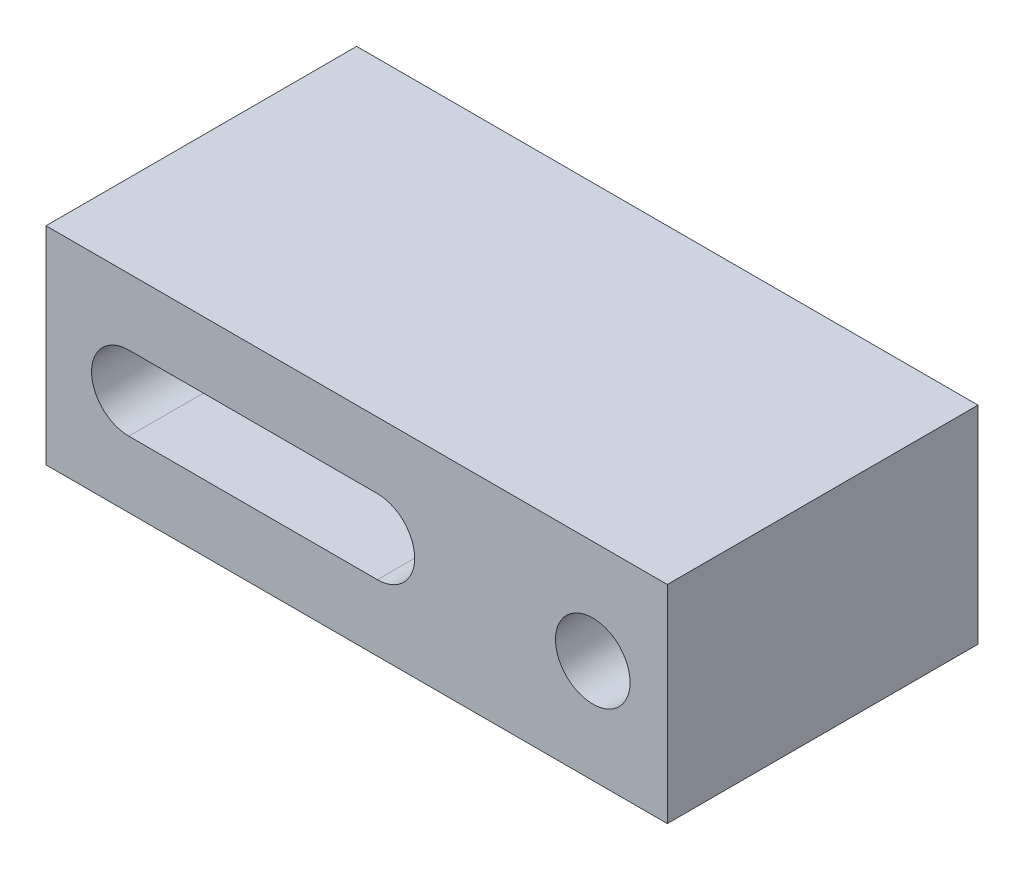
ISO-10303-21;
HEADER;
FILE_DESCRIPTION(('STEP AP214'),'2;1');
FILE_NAME('part.step','',(''),(''),'','','');
FILE_SCHEMA(('AUTOMOTIVE_DESIGN { 1 0 10303 214 1 1 1 1 }'));
ENDSEC;
DATA;
#1=APPLICATION_CONTEXT('core data for automotive mechanical design processes');
#2=APPLICATION_PROTOCOL_DEFINITION('international standard','automotive_design',2000,#1);
#3=PRODUCT_CONTEXT('',#1,'mechanical');
#4=PRODUCT('Part','Part','',(#3));
#5=PRODUCT_RELATED_PRODUCT_CATEGORY('part','',(#4));
#6=PRODUCT_DEFINITION_FORMATION('','',#4);
#7=PRODUCT_DEFINITION_CONTEXT('part definition',#1,'design');
#8=PRODUCT_DEFINITION('design','',#6,#7);
#9=PRODUCT_DEFINITION_SHAPE('','',#8);
#10=(LENGTH_UNIT() NAMED_UNIT(*) SI_UNIT(.MILLI.,.METRE.));
#11=(NAMED_UNIT(*) PLANE_ANGLE_UNIT() SI_UNIT($,.RADIAN.));
#12=(NAMED_UNIT(*) SI_UNIT($,.STERADIAN.) SOLID_ANGLE_UNIT());
#13=UNCERTAINTY_MEASURE_WITH_UNIT(LENGTH_MEASURE(1.E-05),#10,'distance_accuracy_value','');
#14=(GEOMETRIC_REPRESENTATION_CONTEXT(3) GLOBAL_UNCERTAINTY_ASSIGNED_CONTEXT((#13)) GLOBAL_UNIT_ASSIGNED_CONTEXT((#10,
#11,#12)) REPRESENTATION_CONTEXT('',''));
#15=CARTESIAN_POINT('',(0.,0.,0.));
#16=DIRECTION('',(0.,0.,1.));
#17=DIRECTION('',(1.,0.,0.));
#18=AXIS2_PLACEMENT_3D('',#15,#16,#17);
#19=CARTESIAN_POINT('',(750.,500.,-375.));
#20=DIRECTION('',(-1.,0.,0.));
#21=DIRECTION('',(0.,0.,1.));
#22=AXIS2_PLACEMENT_3D('',#19,#20,#21);
#23=PLANE('',#22);
#24=DIRECTION('',(0.,0.,-1.));
#25=VECTOR('',#24,1.);
#26=CARTESIAN_POINT('',(750.,0.,-375.));
#27=LINE('',#26,#25);
#28=CARTESIAN_POINT('',(750.,0.,375.));
#29=VERTEX_POINT('',#28);
#30=CARTESIAN_POINT('',(750.,0.,-375.));
#31=VERTEX_POINT('',#30);
#32=EDGE_CURVE('E135',#29,#31,#27,.T.);
#33=ORIENTED_EDGE('',*,*,#32,.T.);
#34=DIRECTION('',(0.,-1.,0.));
#35=VECTOR('',#34,1.);
#36=CARTESIAN_POINT('',(750.,500.,-375.));
#37=LINE('',#36,#35);
#38=CARTESIAN_POINT('',(750.,500.,-375.));
#39=VERTEX_POINT('',#38);
#40=EDGE_CURVE('E11',#39,#31,#37,.T.);
#41=ORIENTED_EDGE('',*,*,#40,.F.);
#42=DIRECTION('',(0.,0.,-1.));
#43=VECTOR('',#42,1.);
#44=CARTESIAN_POINT('',(750.,500.,-375.));
#45=LINE('',#44,#43);
#46=CARTESIAN_POINT('',(750.,500.,375.));
#47=VERTEX_POINT('',#46);
#48=EDGE_CURVE('E144',#47,#39,#45,.T.);
#49=ORIENTED_EDGE('',*,*,#48,.F.);
#50=DIRECTION('',(0.,-1.,0.));
#51=VECTOR('',#50,1.);
#52=CARTESIAN_POINT('',(750.,500.,375.));
#53=LINE('',#52,#51);
#54=EDGE_CURVE('E154',#47,#29,#53,.T.);
#55=ORIENTED_EDGE('',*,*,#54,.T.);
#56=EDGE_LOOP('',(#33,#41,#49,#55));
#57=FACE_BOUND('',#56,.T.);
#58=ADVANCED_FACE('F37',(#57),#23,.F.);
#59=CARTESIAN_POINT('',(-750.,500.,-375.));
#60=DIRECTION('',(0.,0.,1.));
#61=DIRECTION('',(1.,0.,0.));
#62=AXIS2_PLACEMENT_3D('',#59,#60,#61);
#63=PLANE('',#62);
#64=DIRECTION('',(-1.,0.,0.));
#65=VECTOR('',#64,1.);
#66=CARTESIAN_POINT('',(-550.000000000001,340.,-375.));
#67=LINE('',#66,#65);
#68=CARTESIAN_POINT('',(49.9999999999993,340.,-375.));
#69=VERTEX_POINT('',#68);
#70=CARTESIAN_POINT('',(-550.000000000001,340.,-375.));
#71=VERTEX_POINT('',#70);
#72=EDGE_CURVE('E109',#69,#71,#67,.T.);
#73=ORIENTED_EDGE('',*,*,#72,.T.);
#74=CARTESIAN_POINT('',(-550.000000000001,250.,-375.));
#75=DIRECTION('',(0.,0.,1.));
#76=DIRECTION('',(1.,0.,0.));
#77=AXIS2_PLACEMENT_3D('',#74,#75,#76);
#78=CIRCLE('',#77,90.);
#79=CARTESIAN_POINT('',(-550.000000000001,160.,-375.));
#80=VERTEX_POINT('',#79);
#81=EDGE_CURVE('E103',#71,#80,#78,.T.);
#82=ORIENTED_EDGE('',*,*,#81,.T.);
#83=DIRECTION('',(1.,0.,0.));
#84=VECTOR('',#83,1.);
#85=CARTESIAN_POINT('',(-550.000000000001,160.,-375.));
#86=LINE('',#85,#84);
#87=CARTESIAN_POINT('',(49.9999999999993,160.,-375.));
#88=VERTEX_POINT('',#87);
#89=EDGE_CURVE('E112',#80,#88,#86,.T.);
#90=ORIENTED_EDGE('',*,*,#89,.T.);
#91=CARTESIAN_POINT('',(49.9999999999993,250.,-375.));
#92=DIRECTION('',(0.,0.,1.));
#93=DIRECTION('',(1.,0.,0.));
#94=AXIS2_PLACEMENT_3D('',#91,#92,#93);
#95=CIRCLE('',#94,90.);
#96=EDGE_CURVE('E51',#88,#69,#95,.T.);
#97=ORIENTED_EDGE('',*,*,#96,.T.);
#98=EDGE_LOOP('',(#73,#82,#90,#97));
#99=FACE_BOUND('',#98,.T.);
#100=CARTESIAN_POINT('',(570.,250.,-375.));
#101=DIRECTION('',(0.,0.,1.));
#102=DIRECTION('',(1.,0.,0.));
#103=AXIS2_PLACEMENT_3D('',#100,#101,#102);
#104=CIRCLE('',#103,90.0000000000002);
#105=CARTESIAN_POINT('',(660.,250.,-375.));
#106=VERTEX_POINT('',#105);
#107=EDGE_CURVE('E141',#106,#106,#104,.T.);
#108=ORIENTED_EDGE('',*,*,#107,.T.);
#109=EDGE_LOOP('',(#108));
#110=FACE_BOUND('',#109,.T.);
#111=DIRECTION('',(-1.,0.,0.));
#112=VECTOR('',#111,1.);
#113=CARTESIAN_POINT('',(-750.,0.,-375.));
#114=LINE('',#113,#112);
#115=CARTESIAN_POINT('',(-750.,0.,-375.));
#116=VERTEX_POINT('',#115);
#117=EDGE_CURVE('E157',#31,#116,#114,.T.);
#118=ORIENTED_EDGE('',*,*,#117,.T.);
#119=DIRECTION('',(0.,-1.,0.));
#120=VECTOR('',#119,1.);
#121=CARTESIAN_POINT('',(-750.,500.,-375.));
#122=LINE('',#121,#120);
#123=CARTESIAN_POINT('',(-750.,500.,-375.));
#124=VERTEX_POINT('',#123);
#125=EDGE_CURVE('E44',#124,#116,#122,.T.);
#126=ORIENTED_EDGE('',*,*,#125,.F.);
#127=DIRECTION('',(-1.,0.,0.));
#128=VECTOR('',#127,1.);
#129=CARTESIAN_POINT('',(-750.,500.,-375.));
#130=LINE('',#129,#128);
#131=EDGE_CURVE('E147',#39,#124,#130,.T.);
#132=ORIENTED_EDGE('',*,*,#131,.F.);
#133=ORIENTED_EDGE('',*,*,#40,.T.);
#134=EDGE_LOOP('',(#118,#126,#132,#133));
#135=FACE_BOUND('',#134,.T.);
#136=ADVANCED_FACE('F116',(#99,#110,#135),#63,.F.);
#137=CARTESIAN_POINT('',(-750.,500.,-375.));
#138=DIRECTION('',(1.,0.,0.));
#139=DIRECTION('',(0.,0.,-1.));
#140=AXIS2_PLACEMENT_3D('',#137,#138,#139);
#141=PLANE('',#140);
#142=DIRECTION('',(0.,0.,1.));
#143=VECTOR('',#142,1.);
#144=CARTESIAN_POINT('',(-750.,0.,-375.));
#145=LINE('',#144,#143);
#146=CARTESIAN_POINT('',(-750.000000000001,0.,375.));
#147=VERTEX_POINT('',#146);
#148=EDGE_CURVE('E159',#116,#147,#145,.T.);
#149=ORIENTED_EDGE('',*,*,#148,.T.);
#150=DIRECTION('',(0.,-1.,0.));
#151=VECTOR('',#150,1.);
#152=CARTESIAN_POINT('',(-750.000000000001,500.,375.));
#153=LINE('',#152,#151);
#154=CARTESIAN_POINT('',(-750.000000000001,500.,375.));
#155=VERTEX_POINT('',#154);
#156=EDGE_CURVE('E164',#155,#147,#153,.T.);
#157=ORIENTED_EDGE('',*,*,#156,.F.);
#158=DIRECTION('',(0.,0.,1.));
#159=VECTOR('',#158,1.);
#160=CARTESIAN_POINT('',(-750.,500.,-375.));
#161=LINE('',#160,#159);
#162=EDGE_CURVE('E150',#124,#155,#161,.T.);
#163=ORIENTED_EDGE('',*,*,#162,.F.);
#164=ORIENTED_EDGE('',*,*,#125,.T.);
#165=EDGE_LOOP('',(#149,#157,#163,#164));
#166=FACE_BOUND('',#165,.T.);
#167=ADVANCED_FACE('F171',(#166),#141,.F.);
#168=CARTESIAN_POINT('',(-750.000000000001,500.,375.));
#169=DIRECTION('',(0.,0.,-1.));
#170=DIRECTION('',(-1.,0.,0.));
#171=AXIS2_PLACEMENT_3D('',#168,#169,#170);
#172=PLANE('',#171);
#173=DIRECTION('',(1.,0.,0.));
#174=VECTOR('',#173,1.);
#175=CARTESIAN_POINT('',(-550.000000000001,160.,375.));
#176=LINE('',#175,#174);
#177=CARTESIAN_POINT('',(-550.000000000001,160.,375.));
#178=VERTEX_POINT('',#177);
#179=CARTESIAN_POINT('',(49.9999999999993,160.,375.));
#180=VERTEX_POINT('',#179);
#181=EDGE_CURVE('E128',#178,#180,#176,.T.);
#182=ORIENTED_EDGE('',*,*,#181,.F.);
#183=CARTESIAN_POINT('',(-550.000000000001,250.,375.));
#184=DIRECTION('',(0.,0.,1.));
#185=DIRECTION('',(1.,0.,0.));
#186=AXIS2_PLACEMENT_3D('',#183,#184,#185);
#187=CIRCLE('',#186,90.);
#188=CARTESIAN_POINT('',(-550.000000000001,340.,375.));
#189=VERTEX_POINT('',#188);
#190=EDGE_CURVE('E59',#189,#178,#187,.T.);
#191=ORIENTED_EDGE('',*,*,#190,.F.);
#192=DIRECTION('',(-1.,0.,0.));
#193=VECTOR('',#192,1.);
#194=CARTESIAN_POINT('',(-550.000000000001,340.,375.));
#195=LINE('',#194,#193);
#196=CARTESIAN_POINT('',(49.9999999999993,340.,375.));
#197=VERTEX_POINT('',#196);
#198=EDGE_CURVE('E119',#197,#189,#195,.T.);
#199=ORIENTED_EDGE('',*,*,#198,.F.);
#200=CARTESIAN_POINT('',(49.9999999999993,250.,375.));
#201=DIRECTION('',(0.,0.,1.));
#202=DIRECTION('',(1.,0.,0.));
#203=AXIS2_PLACEMENT_3D('',#200,#201,#202);
#204=CIRCLE('',#203,90.);
#205=EDGE_CURVE('E122',#180,#197,#204,.T.);
#206=ORIENTED_EDGE('',*,*,#205,.F.);
#207=EDGE_LOOP('',(#182,#191,#199,#206));
#208=FACE_BOUND('',#207,.T.);
#209=CARTESIAN_POINT('',(570.,250.,375.));
#210=DIRECTION('',(0.,0.,1.));
#211=DIRECTION('',(1.,0.,0.));
#212=AXIS2_PLACEMENT_3D('',#209,#210,#211);
#213=CIRCLE('',#212,90.0000000000002);
#214=CARTESIAN_POINT('',(660.,250.,375.));
#215=VERTEX_POINT('',#214);
#216=EDGE_CURVE('E129',#215,#215,#213,.T.);
#217=ORIENTED_EDGE('',*,*,#216,.F.);
#218=EDGE_LOOP('',(#217));
#219=FACE_BOUND('',#218,.T.);
#220=DIRECTION('',(1.,0.,0.));
#221=VECTOR('',#220,1.);
#222=CARTESIAN_POINT('',(-750.000000000001,0.,375.));
#223=LINE('',#222,#221);
#224=EDGE_CURVE('E148',#147,#29,#223,.T.);
#225=ORIENTED_EDGE('',*,*,#224,.T.);
#226=ORIENTED_EDGE('',*,*,#54,.F.);
#227=DIRECTION('',(1.,0.,0.));
#228=VECTOR('',#227,1.);
#229=CARTESIAN_POINT('',(-750.000000000001,500.,375.));
#230=LINE('',#229,#228);
#231=EDGE_CURVE('E152',#155,#47,#230,.T.);
#232=ORIENTED_EDGE('',*,*,#231,.F.);
#233=ORIENTED_EDGE('',*,*,#156,.T.);
#234=EDGE_LOOP('',(#225,#226,#232,#233));
#235=FACE_BOUND('',#234,.T.);
#236=ADVANCED_FACE('F180',(#208,#219,#235),#172,.F.);
#237=CARTESIAN_POINT('',(0.,500.,0.));
#238=DIRECTION('',(0.,1.,0.));
#239=DIRECTION('',(0.,0.,1.));
#240=AXIS2_PLACEMENT_3D('',#237,#238,#239);
#241=PLANE('',#240);
#242=ORIENTED_EDGE('',*,*,#48,.T.);
#243=ORIENTED_EDGE('',*,*,#131,.T.);
#244=ORIENTED_EDGE('',*,*,#162,.T.);
#245=ORIENTED_EDGE('',*,*,#231,.T.);
#246=EDGE_LOOP('',(#242,#243,#244,#245));
#247=FACE_BOUND('',#246,.T.);
#248=ADVANCED_FACE('F186',(#247),#241,.T.);
#249=CARTESIAN_POINT('',(0.,0.,0.));
#250=DIRECTION('',(0.,1.,0.));
#251=DIRECTION('',(0.,0.,1.));
#252=AXIS2_PLACEMENT_3D('',#249,#250,#251);
#253=PLANE('',#252);
#254=ORIENTED_EDGE('',*,*,#32,.F.);
#255=ORIENTED_EDGE('',*,*,#224,.F.);
#256=ORIENTED_EDGE('',*,*,#148,.F.);
#257=ORIENTED_EDGE('',*,*,#117,.F.);
#258=EDGE_LOOP('',(#254,#255,#256,#257));
#259=FACE_BOUND('',#258,.T.);
#260=ADVANCED_FACE('F177',(#259),#253,.F.);
#261=CARTESIAN_POINT('',(570.,250.,-375.));
#262=DIRECTION('',(0.,0.,1.));
#263=DIRECTION('',(1.,0.,0.));
#264=AXIS2_PLACEMENT_3D('',#261,#262,#263);
#265=CYLINDRICAL_SURFACE('',#264,90.0000000000002);
#266=ORIENTED_EDGE('',*,*,#107,.F.);
#267=EDGE_LOOP('',(#266));
#268=FACE_BOUND('',#267,.T.);
#269=ORIENTED_EDGE('',*,*,#216,.T.);
#270=EDGE_LOOP('',(#269));
#271=FACE_BOUND('',#270,.T.);
#272=ADVANCED_FACE('F199',(#268,#271),#265,.F.);
#273=CARTESIAN_POINT('',(-550.000000000001,250.,-375.));
#274=DIRECTION('',(0.,0.,1.));
#275=DIRECTION('',(1.,0.,0.));
#276=AXIS2_PLACEMENT_3D('',#273,#274,#275);
#277=CYLINDRICAL_SURFACE('',#276,90.);
#278=ORIENTED_EDGE('',*,*,#190,.T.);
#279=DIRECTION('',(0.,0.,1.));
#280=VECTOR('',#279,1.);
#281=CARTESIAN_POINT('',(-550.000000000001,160.,-375.));
#282=LINE('',#281,#280);
#283=EDGE_CURVE('E99',#80,#178,#282,.T.);
#284=ORIENTED_EDGE('',*,*,#283,.F.);
#285=ORIENTED_EDGE('',*,*,#81,.F.);
#286=DIRECTION('',(0.,0.,1.));
#287=VECTOR('',#286,1.);
#288=CARTESIAN_POINT('',(-550.000000000001,340.,-375.));
#289=LINE('',#288,#287);
#290=EDGE_CURVE('E133',#71,#189,#289,.T.);
#291=ORIENTED_EDGE('',*,*,#290,.T.);
#292=EDGE_LOOP('',(#278,#284,#285,#291));
#293=FACE_BOUND('',#292,.T.);
#294=ADVANCED_FACE('F101',(#293),#277,.F.);
#295=CARTESIAN_POINT('',(-550.000000000001,340.,-375.));
#296=DIRECTION('',(0.,1.,0.));
#297=DIRECTION('',(0.,0.,1.));
#298=AXIS2_PLACEMENT_3D('',#295,#296,#297);
#299=PLANE('',#298);
#300=ORIENTED_EDGE('',*,*,#198,.T.);
#301=ORIENTED_EDGE('',*,*,#290,.F.);
#302=ORIENTED_EDGE('',*,*,#72,.F.);
#303=DIRECTION('',(0.,0.,1.));
#304=VECTOR('',#303,1.);
#305=CARTESIAN_POINT('',(49.9999999999993,340.,-375.));
#306=LINE('',#305,#304);
#307=EDGE_CURVE('E136',#69,#197,#306,.T.);
#308=ORIENTED_EDGE('',*,*,#307,.T.);
#309=EDGE_LOOP('',(#300,#301,#302,#308));
#310=FACE_BOUND('',#309,.T.);
#311=ADVANCED_FACE('F207',(#310),#299,.F.);
#312=CARTESIAN_POINT('',(49.9999999999993,250.,-375.));
#313=DIRECTION('',(0.,0.,1.));
#314=DIRECTION('',(1.,0.,0.));
#315=AXIS2_PLACEMENT_3D('',#312,#313,#314);
#316=CYLINDRICAL_SURFACE('',#315,90.);
#317=ORIENTED_EDGE('',*,*,#205,.T.);
#318=ORIENTED_EDGE('',*,*,#307,.F.);
#319=ORIENTED_EDGE('',*,*,#96,.F.);
#320=DIRECTION('',(0.,0.,1.));
#321=VECTOR('',#320,1.);
#322=CARTESIAN_POINT('',(49.9999999999993,160.,-375.));
#323=LINE('',#322,#321);
#324=EDGE_CURVE('E108',#88,#180,#323,.T.);
#325=ORIENTED_EDGE('',*,*,#324,.T.);
#326=EDGE_LOOP('',(#317,#318,#319,#325));
#327=FACE_BOUND('',#326,.T.);
#328=ADVANCED_FACE('F210',(#327),#316,.F.);
#329=CARTESIAN_POINT('',(-550.000000000001,160.,-375.));
#330=DIRECTION('',(0.,-1.,0.));
#331=DIRECTION('',(0.,0.,-1.));
#332=AXIS2_PLACEMENT_3D('',#329,#330,#331);
#333=PLANE('',#332);
#334=ORIENTED_EDGE('',*,*,#181,.T.);
#335=ORIENTED_EDGE('',*,*,#324,.F.);
#336=ORIENTED_EDGE('',*,*,#89,.F.);
#337=ORIENTED_EDGE('',*,*,#283,.T.);
#338=EDGE_LOOP('',(#334,#335,#336,#337));
#339=FACE_BOUND('',#338,.T.);
#340=ADVANCED_FACE('F113',(#339),#333,.F.);
#341=CLOSED_SHELL('',(#58,#136,#167,#236,#248,#260,#272,#294,#311,#328,#340));
#342=MANIFOLD_SOLID_BREP('B2',#341);
#343=ADVANCED_BREP_SHAPE_REPRESENTATION('',(#18,#342),#14);
#344=SHAPE_DEFINITION_REPRESENTATION(#9,#343);
ENDSEC;
END-ISO-10303-21;
